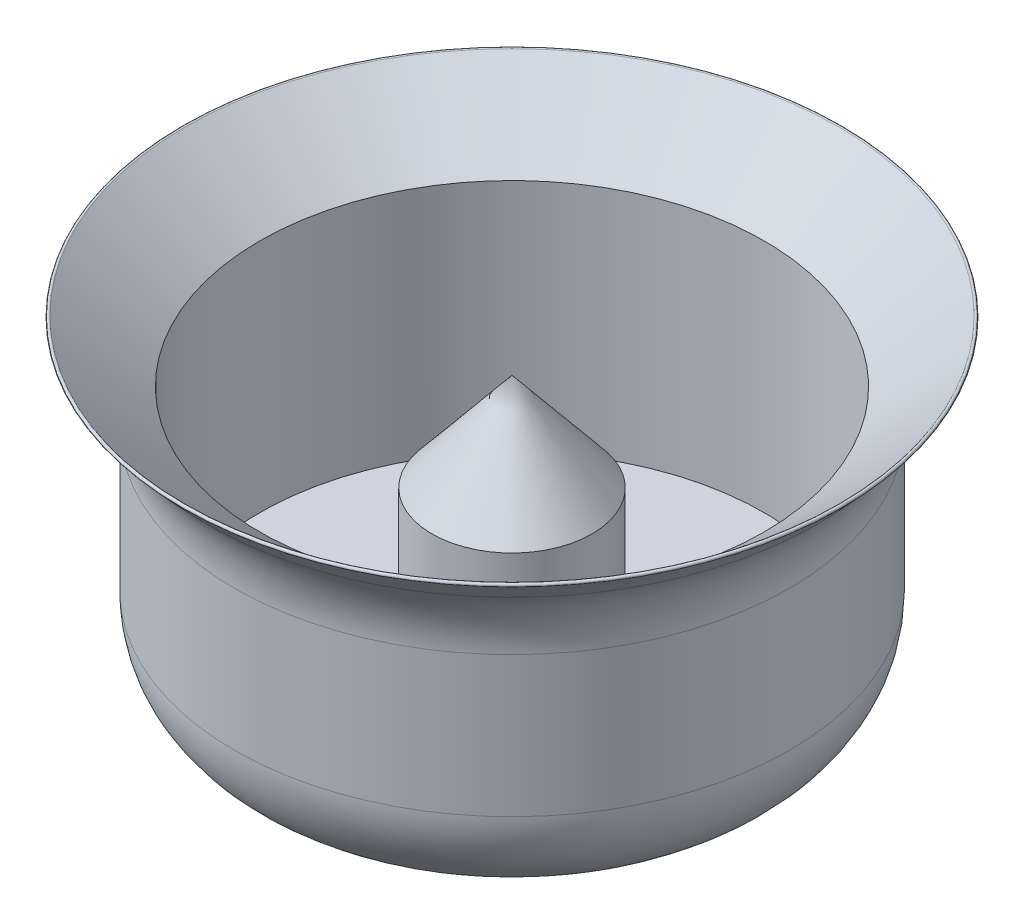
ISO-10303-21;
HEADER;
FILE_DESCRIPTION(('STEP AP214'),'2;1');
FILE_NAME('part.step','',(''),(''),'','','');
FILE_SCHEMA(('AUTOMOTIVE_DESIGN { 1 0 10303 214 1 1 1 1 }'));
ENDSEC;
DATA;
#1=APPLICATION_CONTEXT('core data for automotive mechanical design processes');
#2=APPLICATION_PROTOCOL_DEFINITION('international standard','automotive_design',2000,#1);
#3=PRODUCT_CONTEXT('',#1,'mechanical');
#4=PRODUCT('Part','Part','',(#3));
#5=PRODUCT_RELATED_PRODUCT_CATEGORY('part','',(#4));
#6=PRODUCT_DEFINITION_FORMATION('','',#4);
#7=PRODUCT_DEFINITION_CONTEXT('part definition',#1,'design');
#8=PRODUCT_DEFINITION('design','',#6,#7);
#9=PRODUCT_DEFINITION_SHAPE('','',#8);
#10=(LENGTH_UNIT() NAMED_UNIT(*) SI_UNIT(.MILLI.,.METRE.));
#11=(NAMED_UNIT(*) PLANE_ANGLE_UNIT() SI_UNIT($,.RADIAN.));
#12=(NAMED_UNIT(*) SI_UNIT($,.STERADIAN.) SOLID_ANGLE_UNIT());
#13=UNCERTAINTY_MEASURE_WITH_UNIT(LENGTH_MEASURE(1.E-05),#10,'distance_accuracy_value','');
#14=(GEOMETRIC_REPRESENTATION_CONTEXT(3) GLOBAL_UNCERTAINTY_ASSIGNED_CONTEXT((#13)) GLOBAL_UNIT_ASSIGNED_CONTEXT((#10,
#11,#12)) REPRESENTATION_CONTEXT('',''));
#15=CARTESIAN_POINT('',(0.,0.,0.));
#16=DIRECTION('',(0.,0.,1.));
#17=DIRECTION('',(1.,0.,0.));
#18=AXIS2_PLACEMENT_3D('',#15,#16,#17);
#19=CARTESIAN_POINT('',(0.,17.0744001174564,0.));
#20=DIRECTION('',(0.,-1.,0.));
#21=DIRECTION('',(1.,0.,0.));
#22=AXIS2_PLACEMENT_3D('',#19,#20,#21);
#23=CONICAL_SURFACE('',#22,0.,0.688643861685064);
#24=CARTESIAN_POINT('',(0.,11.2850198891218,0.));
#25=DIRECTION('',(0.,-1.,0.));
#26=DIRECTION('',(1.,0.,0.));
#27=AXIS2_PLACEMENT_3D('',#24,#25,#26);
#28=CIRCLE('',#27,4.765);
#29=CARTESIAN_POINT('',(4.765,11.2850198891218,0.));
#30=VERTEX_POINT('',#29);
#31=EDGE_CURVE('E133',#30,#30,#28,.T.);
#32=ORIENTED_EDGE('',*,*,#31,.F.);
#33=EDGE_LOOP('',(#32));
#34=FACE_BOUND('',#33,.T.);
#35=CARTESIAN_POINT('',(0.,17.0744001174564,0.));
#36=VERTEX_POINT('',#35);
#37=VERTEX_LOOP('',#36);
#38=FACE_BOUND('',#37,.T.);
#39=ADVANCED_FACE('F44',(#34,#38),#23,.T.);
#40=CARTESIAN_POINT('',(0.,0.,0.));
#41=DIRECTION('',(0.,-1.,0.));
#42=DIRECTION('',(1.,0.,0.));
#43=AXIS2_PLACEMENT_3D('',#40,#41,#42);
#44=PLANE('',#43);
#45=CARTESIAN_POINT('',(0.,0.,0.));
#46=DIRECTION('',(0.,-1.,0.));
#47=DIRECTION('',(1.,0.,0.));
#48=AXIS2_PLACEMENT_3D('',#45,#46,#47);
#49=CIRCLE('',#48,10.5);
#50=CARTESIAN_POINT('',(10.5,0.,0.));
#51=VERTEX_POINT('',#50);
#52=EDGE_CURVE('E95',#51,#51,#49,.T.);
#53=ORIENTED_EDGE('',*,*,#52,.T.);
#54=EDGE_LOOP('',(#53));
#55=FACE_BOUND('',#54,.T.);
#56=ADVANCED_FACE('F60',(#55),#44,.T.);
#57=CARTESIAN_POINT('',(0.,0.,0.));
#58=DIRECTION('',(0.,-1.,0.));
#59=DIRECTION('',(1.,0.,0.));
#60=AXIS2_PLACEMENT_3D('',#57,#58,#59);
#61=CYLINDRICAL_SURFACE('',#60,16.5);
#62=CARTESIAN_POINT('',(0.,6.,0.));
#63=DIRECTION('',(0.,-1.,0.));
#64=DIRECTION('',(1.,0.,0.));
#65=AXIS2_PLACEMENT_3D('',#62,#63,#64);
#66=CIRCLE('',#65,16.5);
#67=CARTESIAN_POINT('',(16.5,6.,0.));
#68=VERTEX_POINT('',#67);
#69=EDGE_CURVE('E93',#68,#68,#66,.F.);
#70=ORIENTED_EDGE('',*,*,#69,.T.);
#71=EDGE_LOOP('',(#70));
#72=FACE_BOUND('',#71,.T.);
#73=CARTESIAN_POINT('',(0.,14.3482106193131,0.));
#74=DIRECTION('',(0.,-1.,0.));
#75=DIRECTION('',(1.,0.,0.));
#76=AXIS2_PLACEMENT_3D('',#73,#74,#75);
#77=CIRCLE('',#76,16.5);
#78=CARTESIAN_POINT('',(16.5,14.3482106193131,0.));
#79=VERTEX_POINT('',#78);
#80=EDGE_CURVE('E86',#79,#79,#77,.T.);
#81=ORIENTED_EDGE('',*,*,#80,.T.);
#82=EDGE_LOOP('',(#81));
#83=FACE_BOUND('',#82,.T.);
#84=ADVANCED_FACE('F63',(#72,#83),#61,.T.);
#85=CARTESIAN_POINT('',(0.,21.1175016937605,0.));
#86=DIRECTION('',(0.,1.,0.));
#87=DIRECTION('',(-1.,0.,0.));
#88=AXIS2_PLACEMENT_3D('',#85,#86,#87);
#89=CONICAL_SURFACE('',#88,20.6101727198654,0.750825489848049);
#90=CARTESIAN_POINT('',(0.,20.0056587793393,0.));
#91=DIRECTION('',(0.,1.,0.));
#92=DIRECTION('',(-1.,0.,0.));
#93=AXIS2_PLACEMENT_3D('',#90,#91,#92);
#94=CIRCLE('',#93,19.5726681160097);
#95=CARTESIAN_POINT('',(-19.5726681160097,20.0056587793393,0.));
#96=VERTEX_POINT('',#95);
#97=EDGE_CURVE('E52',#96,#96,#94,.F.);
#98=ORIENTED_EDGE('',*,*,#97,.T.);
#99=EDGE_LOOP('',(#98));
#100=FACE_BOUND('',#99,.T.);
#101=CARTESIAN_POINT('',(0.,18.4416657959663,0.));
#102=DIRECTION('',(0.,1.,0.));
#103=DIRECTION('',(-1.,0.,0.));
#104=AXIS2_PLACEMENT_3D('',#101,#102,#103);
#105=CIRCLE('',#104,18.1132443974241);
#106=CARTESIAN_POINT('',(-18.1132443974241,18.4416657959663,0.));
#107=VERTEX_POINT('',#106);
#108=EDGE_CURVE('E85',#107,#107,#105,.T.);
#109=ORIENTED_EDGE('',*,*,#108,.T.);
#110=EDGE_LOOP('',(#109));
#111=FACE_BOUND('',#110,.T.);
#112=ADVANCED_FACE('F107',(#100,#111),#89,.T.);
#113=CARTESIAN_POINT('',(0.,21.1175016937605,0.));
#114=DIRECTION('',(0.,1.,0.));
#115=DIRECTION('',(-1.,0.,0.));
#116=AXIS2_PLACEMENT_3D('',#113,#114,#115);
#117=CONICAL_SURFACE('',#116,20.6101727198654,0.882152465109833);
#118=CARTESIAN_POINT('',(0.,20.1510938860826,0.));
#119=DIRECTION('',(0.,1.,0.));
#120=DIRECTION('',(-1.,0.,0.));
#121=AXIS2_PLACEMENT_3D('',#118,#119,#120);
#122=CIRCLE('',#121,19.4360064545394);
#123=CARTESIAN_POINT('',(-19.4360064545394,20.1510938860826,0.));
#124=VERTEX_POINT('',#123);
#125=EDGE_CURVE('E11',#124,#124,#122,.T.);
#126=ORIENTED_EDGE('',*,*,#125,.T.);
#127=EDGE_LOOP('',(#126));
#128=FACE_BOUND('',#127,.T.);
#129=CARTESIAN_POINT('',(0.,16.5,0.));
#130=DIRECTION('',(0.,-1.,0.));
#131=DIRECTION('',(1.,0.,0.));
#132=AXIS2_PLACEMENT_3D('',#129,#130,#131);
#133=CIRCLE('',#132,15.);
#134=CARTESIAN_POINT('',(15.,16.5,0.));
#135=VERTEX_POINT('',#134);
#136=EDGE_CURVE('E97',#135,#135,#133,.T.);
#137=ORIENTED_EDGE('',*,*,#136,.T.);
#138=EDGE_LOOP('',(#137));
#139=FACE_BOUND('',#138,.T.);
#140=ADVANCED_FACE('F112',(#128,#139),#117,.F.);
#141=CARTESIAN_POINT('',(0.,0.,0.));
#142=DIRECTION('',(0.,-1.,0.));
#143=DIRECTION('',(1.,0.,0.));
#144=AXIS2_PLACEMENT_3D('',#141,#142,#143);
#145=CYLINDRICAL_SURFACE('',#144,15.);
#146=ORIENTED_EDGE('',*,*,#136,.F.);
#147=EDGE_LOOP('',(#146));
#148=FACE_BOUND('',#147,.T.);
#149=CARTESIAN_POINT('',(0.,2.5,0.));
#150=DIRECTION('',(0.,-1.,0.));
#151=DIRECTION('',(1.,0.,0.));
#152=AXIS2_PLACEMENT_3D('',#149,#150,#151);
#153=CIRCLE('',#152,15.);
#154=CARTESIAN_POINT('',(15.,2.5,0.));
#155=VERTEX_POINT('',#154);
#156=EDGE_CURVE('E140',#155,#155,#153,.T.);
#157=ORIENTED_EDGE('',*,*,#156,.T.);
#158=EDGE_LOOP('',(#157));
#159=FACE_BOUND('',#158,.T.);
#160=ADVANCED_FACE('F116',(#148,#159),#145,.F.);
#161=CARTESIAN_POINT('',(0.,2.5,0.));
#162=DIRECTION('',(0.,-1.,0.));
#163=DIRECTION('',(1.,0.,0.));
#164=AXIS2_PLACEMENT_3D('',#161,#162,#163);
#165=PLANE('',#164);
#166=ORIENTED_EDGE('',*,*,#156,.F.);
#167=EDGE_LOOP('',(#166));
#168=FACE_BOUND('',#167,.T.);
#169=CARTESIAN_POINT('',(0.,2.5,0.));
#170=DIRECTION('',(0.,-1.,0.));
#171=DIRECTION('',(1.,0.,0.));
#172=AXIS2_PLACEMENT_3D('',#169,#170,#171);
#173=CIRCLE('',#172,4.765);
#174=CARTESIAN_POINT('',(4.765,2.5,0.));
#175=VERTEX_POINT('',#174);
#176=EDGE_CURVE('E137',#175,#175,#173,.T.);
#177=ORIENTED_EDGE('',*,*,#176,.T.);
#178=EDGE_LOOP('',(#177));
#179=FACE_BOUND('',#178,.T.);
#180=ADVANCED_FACE('F124',(#168,#179),#165,.F.);
#181=CARTESIAN_POINT('',(0.,0.,0.));
#182=DIRECTION('',(0.,-1.,0.));
#183=DIRECTION('',(1.,0.,0.));
#184=AXIS2_PLACEMENT_3D('',#181,#182,#183);
#185=CYLINDRICAL_SURFACE('',#184,4.765);
#186=ORIENTED_EDGE('',*,*,#31,.T.);
#187=EDGE_LOOP('',(#186));
#188=FACE_BOUND('',#187,.T.);
#189=ORIENTED_EDGE('',*,*,#176,.F.);
#190=EDGE_LOOP('',(#189));
#191=FACE_BOUND('',#190,.T.);
#192=ADVANCED_FACE('F71',(#188,#191),#185,.T.);
#193=CARTESIAN_POINT('',(0.,6.,0.));
#194=DIRECTION('',(0.,-1.,0.));
#195=DIRECTION('',(1.,0.,0.));
#196=AXIS2_PLACEMENT_3D('',#193,#194,#195);
#197=TOROIDAL_SURFACE('',#196,10.5,6.);
#198=ORIENTED_EDGE('',*,*,#69,.F.);
#199=EDGE_LOOP('',(#198));
#200=FACE_BOUND('',#199,.T.);
#201=ORIENTED_EDGE('',*,*,#52,.F.);
#202=EDGE_LOOP('',(#201));
#203=FACE_BOUND('',#202,.T.);
#204=ADVANCED_FACE('F70',(#200,#203),#197,.T.);
#205=CARTESIAN_POINT('',(0.,14.3482106193131,0.));
#206=DIRECTION('',(0.,-1.,0.));
#207=DIRECTION('',(1.,0.,0.));
#208=AXIS2_PLACEMENT_3D('',#205,#206,#207);
#209=TOROIDAL_SURFACE('',#208,22.5,6.);
#210=ORIENTED_EDGE('',*,*,#108,.F.);
#211=EDGE_LOOP('',(#210));
#212=FACE_BOUND('',#211,.T.);
#213=ORIENTED_EDGE('',*,*,#80,.F.);
#214=EDGE_LOOP('',(#213));
#215=FACE_BOUND('',#214,.T.);
#216=ADVANCED_FACE('F75',(#212,#215),#209,.F.);
#217=CARTESIAN_POINT('',(0.,20.0738830322836,0.));
#218=DIRECTION('',(0.,1.,0.));
#219=DIRECTION('',(-1.,0.,0.));
#220=AXIS2_PLACEMENT_3D('',#217,#218,#219);
#221=TOROIDAL_SURFACE('',#220,19.4995555226334,0.1);
#222=ORIENTED_EDGE('',*,*,#125,.F.);
#223=EDGE_LOOP('',(#222));
#224=FACE_BOUND('',#223,.T.);
#225=ORIENTED_EDGE('',*,*,#97,.F.);
#226=EDGE_LOOP('',(#225));
#227=FACE_BOUND('',#226,.T.);
#228=ADVANCED_FACE('F50',(#224,#227),#221,.T.);
#229=CLOSED_SHELL('',(#39,#56,#84,#112,#140,#160,#180,#192,#204,#216,#228));
#230=MANIFOLD_SOLID_BREP('B2',#229);
#231=ADVANCED_BREP_SHAPE_REPRESENTATION('',(#18,#230),#14);
#232=SHAPE_DEFINITION_REPRESENTATION(#9,#231);
ENDSEC;
END-ISO-10303-21;
